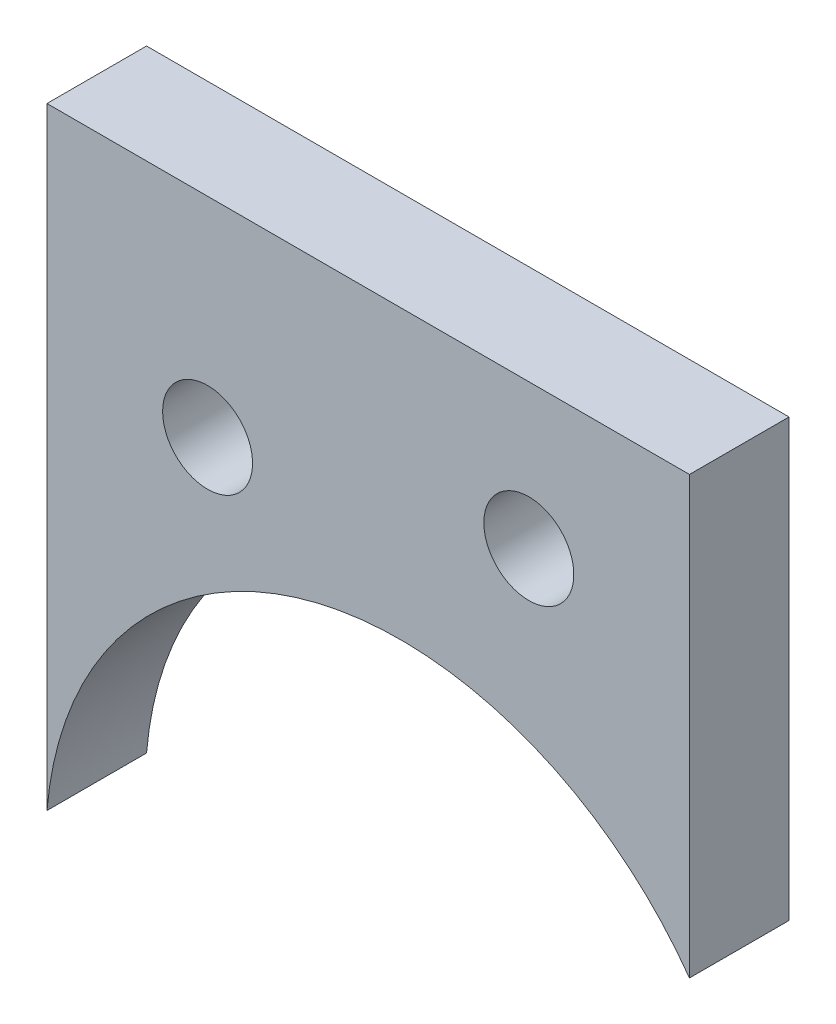
ISO-10303-21;
HEADER;
FILE_DESCRIPTION(('STEP AP214'),'2;1');
FILE_NAME('part.step','',(''),(''),'','','');
FILE_SCHEMA(('AUTOMOTIVE_DESIGN { 1 0 10303 214 1 1 1 1 }'));
ENDSEC;
DATA;
#1=APPLICATION_CONTEXT('core data for automotive mechanical design processes');
#2=APPLICATION_PROTOCOL_DEFINITION('international standard','automotive_design',2000,#1);
#3=PRODUCT_CONTEXT('',#1,'mechanical');
#4=PRODUCT('Part','Part','',(#3));
#5=PRODUCT_RELATED_PRODUCT_CATEGORY('part','',(#4));
#6=PRODUCT_DEFINITION_FORMATION('','',#4);
#7=PRODUCT_DEFINITION_CONTEXT('part definition',#1,'design');
#8=PRODUCT_DEFINITION('design','',#6,#7);
#9=PRODUCT_DEFINITION_SHAPE('','',#8);
#10=(LENGTH_UNIT() NAMED_UNIT(*) SI_UNIT(.MILLI.,.METRE.));
#11=(NAMED_UNIT(*) PLANE_ANGLE_UNIT() SI_UNIT($,.RADIAN.));
#12=(NAMED_UNIT(*) SI_UNIT($,.STERADIAN.) SOLID_ANGLE_UNIT());
#13=UNCERTAINTY_MEASURE_WITH_UNIT(LENGTH_MEASURE(1.E-05),#10,'distance_accuracy_value','');
#14=(GEOMETRIC_REPRESENTATION_CONTEXT(3) GLOBAL_UNCERTAINTY_ASSIGNED_CONTEXT((#13)) GLOBAL_UNIT_ASSIGNED_CONTEXT((#10,
#11,#12)) REPRESENTATION_CONTEXT('',''));
#15=CARTESIAN_POINT('',(0.,0.,0.));
#16=DIRECTION('',(0.,0.,1.));
#17=DIRECTION('',(1.,0.,0.));
#18=AXIS2_PLACEMENT_3D('',#15,#16,#17);
#19=CARTESIAN_POINT('',(11.01,0.,3.1));
#20=DIRECTION('',(0.,0.,1.));
#21=DIRECTION('',(1.,0.,0.));
#22=AXIS2_PLACEMENT_3D('',#19,#20,#21);
#23=PLANE('',#22);
#24=CARTESIAN_POINT('',(5.,13.5,3.1));
#25=DIRECTION('',(0.,0.,1.));
#26=DIRECTION('',(1.,0.,0.));
#27=AXIS2_PLACEMENT_3D('',#24,#25,#26);
#28=CIRCLE('',#27,1.4);
#29=CARTESIAN_POINT('',(3.6,13.5,3.1));
#30=VERTEX_POINT('',#29);
#31=EDGE_CURVE('E116',#30,#30,#28,.T.);
#32=ORIENTED_EDGE('',*,*,#31,.F.);
#33=EDGE_LOOP('',(#32));
#34=FACE_BOUND('',#33,.T.);
#35=DIRECTION('',(0.,1.,0.));
#36=VECTOR('',#35,1.);
#37=CARTESIAN_POINT('',(20.,6.42513813081089,3.1));
#38=LINE('',#37,#36);
#39=CARTESIAN_POINT('',(20.,6.42513813081089,3.1));
#40=VERTEX_POINT('',#39);
#41=CARTESIAN_POINT('',(20.,20.,3.1));
#42=VERTEX_POINT('',#41);
#43=EDGE_CURVE('E96',#40,#42,#38,.T.);
#44=ORIENTED_EDGE('',*,*,#43,.T.);
#45=DIRECTION('',(-1.,0.,0.));
#46=VECTOR('',#45,1.);
#47=CARTESIAN_POINT('',(0.,20.,3.1));
#48=LINE('',#47,#46);
#49=CARTESIAN_POINT('',(0.,20.,3.1));
#50=VERTEX_POINT('',#49);
#51=EDGE_CURVE('E91',#42,#50,#48,.T.);
#52=ORIENTED_EDGE('',*,*,#51,.T.);
#53=DIRECTION('',(0.,-1.,0.));
#54=VECTOR('',#53,1.);
#55=CARTESIAN_POINT('',(0.,0.939361485265461,3.1));
#56=LINE('',#55,#54);
#57=CARTESIAN_POINT('',(0.,0.939361485265461,3.1));
#58=VERTEX_POINT('',#57);
#59=EDGE_CURVE('E94',#50,#58,#56,.T.);
#60=ORIENTED_EDGE('',*,*,#59,.T.);
#61=CARTESIAN_POINT('',(11.01,0.,3.1));
#62=DIRECTION('',(0.,0.,-1.));
#63=DIRECTION('',(1.,0.,0.));
#64=AXIS2_PLACEMENT_3D('',#61,#62,#63);
#65=CIRCLE('',#64,11.05);
#66=EDGE_CURVE('E61',#58,#40,#65,.T.);
#67=ORIENTED_EDGE('',*,*,#66,.T.);
#68=EDGE_LOOP('',(#44,#52,#60,#67));
#69=FACE_BOUND('',#68,.T.);
#70=CARTESIAN_POINT('',(15.,15.5,3.1));
#71=DIRECTION('',(0.,0.,1.));
#72=DIRECTION('',(1.,0.,0.));
#73=AXIS2_PLACEMENT_3D('',#70,#71,#72);
#74=CIRCLE('',#73,1.4);
#75=CARTESIAN_POINT('',(13.6,15.5,3.1));
#76=VERTEX_POINT('',#75);
#77=EDGE_CURVE('E138',#76,#76,#74,.T.);
#78=ORIENTED_EDGE('',*,*,#77,.F.);
#79=EDGE_LOOP('',(#78));
#80=FACE_BOUND('',#79,.T.);
#81=ADVANCED_FACE('F43',(#34,#69,#80),#23,.T.);
#82=CARTESIAN_POINT('',(11.01,0.,0.));
#83=DIRECTION('',(0.,0.,1.));
#84=DIRECTION('',(1.,0.,0.));
#85=AXIS2_PLACEMENT_3D('',#82,#83,#84);
#86=PLANE('',#85);
#87=DIRECTION('',(0.,1.,0.));
#88=VECTOR('',#87,1.);
#89=CARTESIAN_POINT('',(20.,6.42513813081089,0.));
#90=LINE('',#89,#88);
#91=CARTESIAN_POINT('',(20.,6.42513813081089,0.));
#92=VERTEX_POINT('',#91);
#93=CARTESIAN_POINT('',(20.,20.,0.));
#94=VERTEX_POINT('',#93);
#95=EDGE_CURVE('E112',#92,#94,#90,.T.);
#96=ORIENTED_EDGE('',*,*,#95,.F.);
#97=CARTESIAN_POINT('',(11.01,0.,0.));
#98=DIRECTION('',(0.,0.,-1.));
#99=DIRECTION('',(1.,0.,0.));
#100=AXIS2_PLACEMENT_3D('',#97,#98,#99);
#101=CIRCLE('',#100,11.05);
#102=CARTESIAN_POINT('',(0.,0.939361485265461,0.));
#103=VERTEX_POINT('',#102);
#104=EDGE_CURVE('E84',#103,#92,#101,.T.);
#105=ORIENTED_EDGE('',*,*,#104,.F.);
#106=DIRECTION('',(0.,-1.,0.));
#107=VECTOR('',#106,1.);
#108=CARTESIAN_POINT('',(0.,0.939361485265461,0.));
#109=LINE('',#108,#107);
#110=CARTESIAN_POINT('',(0.,20.,0.));
#111=VERTEX_POINT('',#110);
#112=EDGE_CURVE('E78',#111,#103,#109,.T.);
#113=ORIENTED_EDGE('',*,*,#112,.F.);
#114=DIRECTION('',(-1.,0.,0.));
#115=VECTOR('',#114,1.);
#116=CARTESIAN_POINT('',(0.,20.,0.));
#117=LINE('',#116,#115);
#118=EDGE_CURVE('E101',#94,#111,#117,.T.);
#119=ORIENTED_EDGE('',*,*,#118,.F.);
#120=EDGE_LOOP('',(#96,#105,#113,#119));
#121=FACE_BOUND('',#120,.T.);
#122=CARTESIAN_POINT('',(5.,13.5,0.));
#123=DIRECTION('',(0.,0.,1.));
#124=DIRECTION('',(1.,0.,0.));
#125=AXIS2_PLACEMENT_3D('',#122,#123,#124);
#126=CIRCLE('',#125,1.4);
#127=CARTESIAN_POINT('',(3.6,13.5,0.));
#128=VERTEX_POINT('',#127);
#129=EDGE_CURVE('E134',#128,#128,#126,.T.);
#130=ORIENTED_EDGE('',*,*,#129,.T.);
#131=EDGE_LOOP('',(#130));
#132=FACE_BOUND('',#131,.T.);
#133=CARTESIAN_POINT('',(15.,15.5,0.));
#134=DIRECTION('',(0.,0.,1.));
#135=DIRECTION('',(1.,0.,0.));
#136=AXIS2_PLACEMENT_3D('',#133,#134,#135);
#137=CIRCLE('',#136,1.4);
#138=CARTESIAN_POINT('',(13.6,15.5,0.));
#139=VERTEX_POINT('',#138);
#140=EDGE_CURVE('E142',#139,#139,#137,.T.);
#141=ORIENTED_EDGE('',*,*,#140,.T.);
#142=EDGE_LOOP('',(#141));
#143=FACE_BOUND('',#142,.T.);
#144=ADVANCED_FACE('F129',(#121,#132,#143),#86,.F.);
#145=CARTESIAN_POINT('',(20.,6.42513813081089,3.1));
#146=DIRECTION('',(-1.,0.,0.));
#147=DIRECTION('',(0.,0.,1.));
#148=AXIS2_PLACEMENT_3D('',#145,#146,#147);
#149=PLANE('',#148);
#150=ORIENTED_EDGE('',*,*,#95,.T.);
#151=DIRECTION('',(0.,0.,-1.));
#152=VECTOR('',#151,1.);
#153=CARTESIAN_POINT('',(20.,20.,3.1));
#154=LINE('',#153,#152);
#155=EDGE_CURVE('E11',#42,#94,#154,.T.);
#156=ORIENTED_EDGE('',*,*,#155,.F.);
#157=ORIENTED_EDGE('',*,*,#43,.F.);
#158=DIRECTION('',(0.,0.,-1.));
#159=VECTOR('',#158,1.);
#160=CARTESIAN_POINT('',(20.,6.42513813081089,3.1));
#161=LINE('',#160,#159);
#162=EDGE_CURVE('E108',#40,#92,#161,.T.);
#163=ORIENTED_EDGE('',*,*,#162,.T.);
#164=EDGE_LOOP('',(#150,#156,#157,#163));
#165=FACE_BOUND('',#164,.T.);
#166=ADVANCED_FACE('F45',(#165),#149,.F.);
#167=CARTESIAN_POINT('',(0.,20.,3.1));
#168=DIRECTION('',(0.,-1.,0.));
#169=DIRECTION('',(0.,0.,-1.));
#170=AXIS2_PLACEMENT_3D('',#167,#168,#169);
#171=PLANE('',#170);
#172=ORIENTED_EDGE('',*,*,#118,.T.);
#173=DIRECTION('',(0.,0.,-1.));
#174=VECTOR('',#173,1.);
#175=CARTESIAN_POINT('',(0.,20.,3.1));
#176=LINE('',#175,#174);
#177=EDGE_CURVE('E53',#50,#111,#176,.T.);
#178=ORIENTED_EDGE('',*,*,#177,.F.);
#179=ORIENTED_EDGE('',*,*,#51,.F.);
#180=ORIENTED_EDGE('',*,*,#155,.T.);
#181=EDGE_LOOP('',(#172,#178,#179,#180));
#182=FACE_BOUND('',#181,.T.);
#183=ADVANCED_FACE('F100',(#182),#171,.F.);
#184=CARTESIAN_POINT('',(0.,0.939361485265461,3.1));
#185=DIRECTION('',(1.,0.,0.));
#186=DIRECTION('',(0.,0.,-1.));
#187=AXIS2_PLACEMENT_3D('',#184,#185,#186);
#188=PLANE('',#187);
#189=ORIENTED_EDGE('',*,*,#112,.T.);
#190=DIRECTION('',(0.,0.,-1.));
#191=VECTOR('',#190,1.);
#192=CARTESIAN_POINT('',(0.,0.939361485265461,3.1));
#193=LINE('',#192,#191);
#194=EDGE_CURVE('E103',#58,#103,#193,.T.);
#195=ORIENTED_EDGE('',*,*,#194,.F.);
#196=ORIENTED_EDGE('',*,*,#59,.F.);
#197=ORIENTED_EDGE('',*,*,#177,.T.);
#198=EDGE_LOOP('',(#189,#195,#196,#197));
#199=FACE_BOUND('',#198,.T.);
#200=ADVANCED_FACE('F104',(#199),#188,.F.);
#201=CARTESIAN_POINT('',(11.01,0.,3.1));
#202=DIRECTION('',(0.,0.,-1.));
#203=DIRECTION('',(-1.,0.,0.));
#204=AXIS2_PLACEMENT_3D('',#201,#202,#203);
#205=CYLINDRICAL_SURFACE('',#204,11.05);
#206=ORIENTED_EDGE('',*,*,#104,.T.);
#207=ORIENTED_EDGE('',*,*,#162,.F.);
#208=ORIENTED_EDGE('',*,*,#66,.F.);
#209=ORIENTED_EDGE('',*,*,#194,.T.);
#210=EDGE_LOOP('',(#206,#207,#208,#209));
#211=FACE_BOUND('',#210,.T.);
#212=ADVANCED_FACE('F126',(#211),#205,.F.);
#213=CARTESIAN_POINT('',(5.,13.5,3.1));
#214=DIRECTION('',(0.,0.,-1.));
#215=DIRECTION('',(-1.,0.,0.));
#216=AXIS2_PLACEMENT_3D('',#213,#214,#215);
#217=CYLINDRICAL_SURFACE('',#216,1.4);
#218=CARTESIAN_POINT('',(3.6,13.5,3.1));
#219=CARTESIAN_POINT('',(3.6,13.5,3.06770833333333));
#220=CARTESIAN_POINT('',(3.6,13.5,3.03541666666667));
#221=CARTESIAN_POINT('',(3.6,13.5,2.97083333333333));
#222=CARTESIAN_POINT('',(3.6,13.5,2.93854166666667));
#223=CARTESIAN_POINT('',(3.6,13.5,2.87395833333333));
#224=CARTESIAN_POINT('',(3.6,13.5,2.84166666666667));
#225=CARTESIAN_POINT('',(3.6,13.5,2.77708333333333));
#226=CARTESIAN_POINT('',(3.6,13.5,2.74479166666667));
#227=CARTESIAN_POINT('',(3.6,13.5,2.68020833333333));
#228=CARTESIAN_POINT('',(3.6,13.5,2.64791666666667));
#229=CARTESIAN_POINT('',(3.6,13.5,2.58333333333333));
#230=CARTESIAN_POINT('',(3.6,13.5,2.55104166666667));
#231=CARTESIAN_POINT('',(3.6,13.5,2.48645833333333));
#232=CARTESIAN_POINT('',(3.6,13.5,2.45416666666667));
#233=CARTESIAN_POINT('',(3.6,13.5,2.38958333333333));
#234=CARTESIAN_POINT('',(3.6,13.5,2.35729166666667));
#235=CARTESIAN_POINT('',(3.6,13.5,2.29270833333333));
#236=CARTESIAN_POINT('',(3.6,13.5,2.26041666666667));
#237=CARTESIAN_POINT('',(3.6,13.5,2.19583333333333));
#238=CARTESIAN_POINT('',(3.6,13.5,2.16354166666667));
#239=CARTESIAN_POINT('',(3.6,13.5,2.09895833333333));
#240=CARTESIAN_POINT('',(3.6,13.5,2.06666666666667));
#241=CARTESIAN_POINT('',(3.6,13.5,2.00208333333333));
#242=CARTESIAN_POINT('',(3.6,13.5,1.96979166666667));
#243=CARTESIAN_POINT('',(3.6,13.5,1.90520833333333));
#244=CARTESIAN_POINT('',(3.6,13.5,1.87291666666667));
#245=CARTESIAN_POINT('',(3.6,13.5,1.80833333333333));
#246=CARTESIAN_POINT('',(3.6,13.5,1.77604166666667));
#247=CARTESIAN_POINT('',(3.6,13.5,1.71145833333333));
#248=CARTESIAN_POINT('',(3.6,13.5,1.67916666666667));
#249=CARTESIAN_POINT('',(3.6,13.5,1.61458333333333));
#250=CARTESIAN_POINT('',(3.6,13.5,1.58229166666667));
#251=CARTESIAN_POINT('',(3.6,13.5,1.51770833333333));
#252=CARTESIAN_POINT('',(3.6,13.5,1.48541666666667));
#253=CARTESIAN_POINT('',(3.6,13.5,1.42083333333333));
#254=CARTESIAN_POINT('',(3.6,13.5,1.38854166666667));
#255=CARTESIAN_POINT('',(3.6,13.5,1.32395833333333));
#256=CARTESIAN_POINT('',(3.6,13.5,1.29166666666667));
#257=CARTESIAN_POINT('',(3.6,13.5,1.22708333333333));
#258=CARTESIAN_POINT('',(3.6,13.5,1.19479166666667));
#259=CARTESIAN_POINT('',(3.6,13.5,1.13020833333333));
#260=CARTESIAN_POINT('',(3.6,13.5,1.09791666666667));
#261=CARTESIAN_POINT('',(3.6,13.5,1.03333333333333));
#262=CARTESIAN_POINT('',(3.6,13.5,1.00104166666667));
#263=CARTESIAN_POINT('',(3.6,13.5,0.936458333333333));
#264=CARTESIAN_POINT('',(3.6,13.5,0.904166666666667));
#265=CARTESIAN_POINT('',(3.6,13.5,0.839583333333334));
#266=CARTESIAN_POINT('',(3.6,13.5,0.807291666666667));
#267=CARTESIAN_POINT('',(3.6,13.5,0.742708333333333));
#268=CARTESIAN_POINT('',(3.6,13.5,0.710416666666667));
#269=CARTESIAN_POINT('',(3.6,13.5,0.645833333333333));
#270=CARTESIAN_POINT('',(3.6,13.5,0.613541666666667));
#271=CARTESIAN_POINT('',(3.6,13.5,0.548958333333333));
#272=CARTESIAN_POINT('',(3.6,13.5,0.516666666666667));
#273=CARTESIAN_POINT('',(3.6,13.5,0.452083333333333));
#274=CARTESIAN_POINT('',(3.6,13.5,0.419791666666667));
#275=CARTESIAN_POINT('',(3.6,13.5,0.355208333333333));
#276=CARTESIAN_POINT('',(3.6,13.5,0.322916666666667));
#277=CARTESIAN_POINT('',(3.6,13.5,0.258333333333333));
#278=CARTESIAN_POINT('',(3.6,13.5,0.226041666666667));
#279=CARTESIAN_POINT('',(3.6,13.5,0.161458333333333));
#280=CARTESIAN_POINT('',(3.6,13.5,0.129166666666667));
#281=CARTESIAN_POINT('',(3.6,13.5,0.0645833333333335));
#282=CARTESIAN_POINT('',(3.6,13.5,0.0322916666666667));
#283=CARTESIAN_POINT('',(3.6,13.5,0.));
#284=B_SPLINE_CURVE_WITH_KNOTS('',3,(#218,#219,#220,#221,#222,#223,#224,#225,#226,#227,#228,
#229,#230,#231,#232,#233,#234,#235,#236,#237,#238,#239,#240,#241,#242,#243,#244,#245,#246,#247,
#248,#249,#250,#251,#252,#253,#254,#255,#256,#257,#258,#259,#260,#261,#262,#263,#264,#265,#266,
#267,#268,#269,#270,#271,#272,#273,#274,#275,#276,#277,#278,#279,#280,#281,#282,#283),
.UNSPECIFIED.,.F.,.F.,(4,2,2,2,2,2,2,2,2,2,2,2,2,2,2,2,2,2,2,2,2,2,2,2,2,2,2,2,2,2,2,2,4),(0.,
0.0968750000000002,0.19375,0.290625,0.3875,0.484375,0.58125,0.678125,0.775,0.871875,0.96875,
1.065625,1.1625,1.259375,1.35625,1.453125,1.55,1.646875,1.74375,1.840625,1.9375,2.034375,
2.13125,2.228125,2.325,2.421875,2.51875,2.615625,2.7125,2.809375,2.90625,3.003125,3.1),.UNSPECIFIED.);
#285=EDGE_CURVE('BSEAM161',#30,#128,#284,.T.);
#286=ORIENTED_EDGE('',*,*,#31,.T.);
#287=ORIENTED_EDGE('',*,*,#129,.F.);
#288=ORIENTED_EDGE('',*,*,#285,.T.);
#289=ORIENTED_EDGE('',*,*,#285,.F.);
#290=EDGE_LOOP('',(#286,#288,#287,#289));
#291=FACE_BOUND('',#290,.T.);
#292=ADVANCED_FACE('F161',(#291),#217,.F.);
#293=CARTESIAN_POINT('',(15.,15.5,3.1));
#294=DIRECTION('',(0.,0.,-1.));
#295=DIRECTION('',(-1.,0.,0.));
#296=AXIS2_PLACEMENT_3D('',#293,#294,#295);
#297=CYLINDRICAL_SURFACE('',#296,1.4);
#298=CARTESIAN_POINT('',(13.6,15.5,3.1));
#299=CARTESIAN_POINT('',(13.6,15.5,3.06770833333333));
#300=CARTESIAN_POINT('',(13.6,15.5,3.03541666666667));
#301=CARTESIAN_POINT('',(13.6,15.5,2.97083333333333));
#302=CARTESIAN_POINT('',(13.6,15.5,2.93854166666667));
#303=CARTESIAN_POINT('',(13.6,15.5,2.87395833333333));
#304=CARTESIAN_POINT('',(13.6,15.5,2.84166666666667));
#305=CARTESIAN_POINT('',(13.6,15.5,2.77708333333333));
#306=CARTESIAN_POINT('',(13.6,15.5,2.74479166666667));
#307=CARTESIAN_POINT('',(13.6,15.5,2.68020833333333));
#308=CARTESIAN_POINT('',(13.6,15.5,2.64791666666667));
#309=CARTESIAN_POINT('',(13.6,15.5,2.58333333333333));
#310=CARTESIAN_POINT('',(13.6,15.5,2.55104166666667));
#311=CARTESIAN_POINT('',(13.6,15.5,2.48645833333333));
#312=CARTESIAN_POINT('',(13.6,15.5,2.45416666666667));
#313=CARTESIAN_POINT('',(13.6,15.5,2.38958333333333));
#314=CARTESIAN_POINT('',(13.6,15.5,2.35729166666667));
#315=CARTESIAN_POINT('',(13.6,15.5,2.29270833333333));
#316=CARTESIAN_POINT('',(13.6,15.5,2.26041666666667));
#317=CARTESIAN_POINT('',(13.6,15.5,2.19583333333333));
#318=CARTESIAN_POINT('',(13.6,15.5,2.16354166666667));
#319=CARTESIAN_POINT('',(13.6,15.5,2.09895833333333));
#320=CARTESIAN_POINT('',(13.6,15.5,2.06666666666667));
#321=CARTESIAN_POINT('',(13.6,15.5,2.00208333333333));
#322=CARTESIAN_POINT('',(13.6,15.5,1.96979166666667));
#323=CARTESIAN_POINT('',(13.6,15.5,1.90520833333333));
#324=CARTESIAN_POINT('',(13.6,15.5,1.87291666666667));
#325=CARTESIAN_POINT('',(13.6,15.5,1.80833333333333));
#326=CARTESIAN_POINT('',(13.6,15.5,1.77604166666667));
#327=CARTESIAN_POINT('',(13.6,15.5,1.71145833333333));
#328=CARTESIAN_POINT('',(13.6,15.5,1.67916666666667));
#329=CARTESIAN_POINT('',(13.6,15.5,1.61458333333333));
#330=CARTESIAN_POINT('',(13.6,15.5,1.58229166666667));
#331=CARTESIAN_POINT('',(13.6,15.5,1.51770833333333));
#332=CARTESIAN_POINT('',(13.6,15.5,1.48541666666667));
#333=CARTESIAN_POINT('',(13.6,15.5,1.42083333333333));
#334=CARTESIAN_POINT('',(13.6,15.5,1.38854166666667));
#335=CARTESIAN_POINT('',(13.6,15.5,1.32395833333333));
#336=CARTESIAN_POINT('',(13.6,15.5,1.29166666666667));
#337=CARTESIAN_POINT('',(13.6,15.5,1.22708333333333));
#338=CARTESIAN_POINT('',(13.6,15.5,1.19479166666667));
#339=CARTESIAN_POINT('',(13.6,15.5,1.13020833333333));
#340=CARTESIAN_POINT('',(13.6,15.5,1.09791666666667));
#341=CARTESIAN_POINT('',(13.6,15.5,1.03333333333333));
#342=CARTESIAN_POINT('',(13.6,15.5,1.00104166666667));
#343=CARTESIAN_POINT('',(13.6,15.5,0.936458333333333));
#344=CARTESIAN_POINT('',(13.6,15.5,0.904166666666667));
#345=CARTESIAN_POINT('',(13.6,15.5,0.839583333333334));
#346=CARTESIAN_POINT('',(13.6,15.5,0.807291666666667));
#347=CARTESIAN_POINT('',(13.6,15.5,0.742708333333333));
#348=CARTESIAN_POINT('',(13.6,15.5,0.710416666666667));
#349=CARTESIAN_POINT('',(13.6,15.5,0.645833333333333));
#350=CARTESIAN_POINT('',(13.6,15.5,0.613541666666667));
#351=CARTESIAN_POINT('',(13.6,15.5,0.548958333333333));
#352=CARTESIAN_POINT('',(13.6,15.5,0.516666666666667));
#353=CARTESIAN_POINT('',(13.6,15.5,0.452083333333333));
#354=CARTESIAN_POINT('',(13.6,15.5,0.419791666666667));
#355=CARTESIAN_POINT('',(13.6,15.5,0.355208333333333));
#356=CARTESIAN_POINT('',(13.6,15.5,0.322916666666667));
#357=CARTESIAN_POINT('',(13.6,15.5,0.258333333333333));
#358=CARTESIAN_POINT('',(13.6,15.5,0.226041666666667));
#359=CARTESIAN_POINT('',(13.6,15.5,0.161458333333333));
#360=CARTESIAN_POINT('',(13.6,15.5,0.129166666666667));
#361=CARTESIAN_POINT('',(13.6,15.5,0.0645833333333335));
#362=CARTESIAN_POINT('',(13.6,15.5,0.0322916666666667));
#363=CARTESIAN_POINT('',(13.6,15.5,0.));
#364=B_SPLINE_CURVE_WITH_KNOTS('',3,(#298,#299,#300,#301,#302,#303,#304,#305,#306,#307,#308,
#309,#310,#311,#312,#313,#314,#315,#316,#317,#318,#319,#320,#321,#322,#323,#324,#325,#326,#327,
#328,#329,#330,#331,#332,#333,#334,#335,#336,#337,#338,#339,#340,#341,#342,#343,#344,#345,#346,
#347,#348,#349,#350,#351,#352,#353,#354,#355,#356,#357,#358,#359,#360,#361,#362,#363),
.UNSPECIFIED.,.F.,.F.,(4,2,2,2,2,2,2,2,2,2,2,2,2,2,2,2,2,2,2,2,2,2,2,2,2,2,2,2,2,2,2,2,4),(0.,
0.0968750000000002,0.19375,0.290625,0.3875,0.484375,0.58125,0.678125,0.775,0.871875,0.96875,
1.065625,1.1625,1.259375,1.35625,1.453125,1.55,1.646875,1.74375,1.840625,1.9375,2.034375,
2.13125,2.228125,2.325,2.421875,2.51875,2.615625,2.7125,2.809375,2.90625,3.003125,3.1),.UNSPECIFIED.);
#365=EDGE_CURVE('BSEAM150',#76,#139,#364,.T.);
#366=ORIENTED_EDGE('',*,*,#77,.T.);
#367=ORIENTED_EDGE('',*,*,#140,.F.);
#368=ORIENTED_EDGE('',*,*,#365,.T.);
#369=ORIENTED_EDGE('',*,*,#365,.F.);
#370=EDGE_LOOP('',(#366,#368,#367,#369));
#371=FACE_BOUND('',#370,.T.);
#372=ADVANCED_FACE('F150',(#371),#297,.F.);
#373=CLOSED_SHELL('',(#81,#144,#166,#183,#200,#212,#292,#372));
#374=MANIFOLD_SOLID_BREP('B2',#373);
#375=ADVANCED_BREP_SHAPE_REPRESENTATION('',(#18,#374),#14);
#376=SHAPE_DEFINITION_REPRESENTATION(#9,#375);
ENDSEC;
END-ISO-10303-21;
